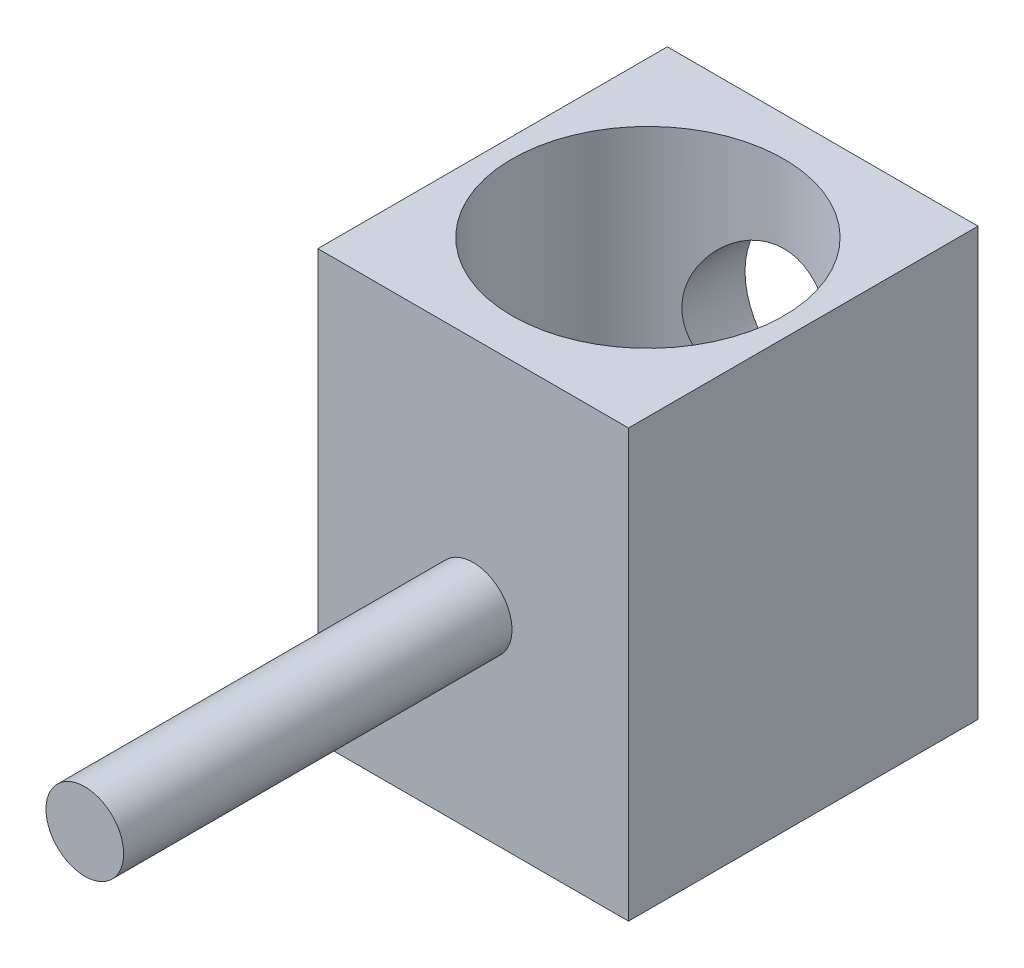
ISO-10303-21;
HEADER;
FILE_DESCRIPTION(('STEP AP214'),'2;1');
FILE_NAME('part.step','',(''),(''),'','','');
FILE_SCHEMA(('AUTOMOTIVE_DESIGN { 1 0 10303 214 1 1 1 1 }'));
ENDSEC;
DATA;
#1=APPLICATION_CONTEXT('core data for automotive mechanical design processes');
#2=APPLICATION_PROTOCOL_DEFINITION('international standard','automotive_design',2000,#1);
#3=PRODUCT_CONTEXT('',#1,'mechanical');
#4=PRODUCT('Part','Part','',(#3));
#5=PRODUCT_RELATED_PRODUCT_CATEGORY('part','',(#4));
#6=PRODUCT_DEFINITION_FORMATION('','',#4);
#7=PRODUCT_DEFINITION_CONTEXT('part definition',#1,'design');
#8=PRODUCT_DEFINITION('design','',#6,#7);
#9=PRODUCT_DEFINITION_SHAPE('','',#8);
#10=(LENGTH_UNIT() NAMED_UNIT(*) SI_UNIT(.MILLI.,.METRE.));
#11=(NAMED_UNIT(*) PLANE_ANGLE_UNIT() SI_UNIT($,.RADIAN.));
#12=(NAMED_UNIT(*) SI_UNIT($,.STERADIAN.) SOLID_ANGLE_UNIT());
#13=UNCERTAINTY_MEASURE_WITH_UNIT(LENGTH_MEASURE(1.E-05),#10,'distance_accuracy_value','');
#14=(GEOMETRIC_REPRESENTATION_CONTEXT(3) GLOBAL_UNCERTAINTY_ASSIGNED_CONTEXT((#13)) GLOBAL_UNIT_ASSIGNED_CONTEXT((#10,
#11,#12)) REPRESENTATION_CONTEXT('',''));
#15=CARTESIAN_POINT('',(0.,0.,0.));
#16=DIRECTION('',(0.,0.,1.));
#17=DIRECTION('',(1.,0.,0.));
#18=AXIS2_PLACEMENT_3D('',#15,#16,#17);
#19=CARTESIAN_POINT('',(2.,5.5,2.25));
#20=DIRECTION('',(-1.,0.,0.));
#21=DIRECTION('',(0.,0.,1.));
#22=AXIS2_PLACEMENT_3D('',#19,#20,#21);
#23=PLANE('',#22);
#24=DIRECTION('',(0.,0.,-1.));
#25=VECTOR('',#24,1.);
#26=CARTESIAN_POINT('',(2.,0.,2.25));
#27=LINE('',#26,#25);
#28=CARTESIAN_POINT('',(2.,0.,2.25));
#29=VERTEX_POINT('',#28);
#30=CARTESIAN_POINT('',(2.,0.,-2.25));
#31=VERTEX_POINT('',#30);
#32=EDGE_CURVE('E103',#29,#31,#27,.T.);
#33=ORIENTED_EDGE('',*,*,#32,.T.);
#34=DIRECTION('',(0.,-1.,0.));
#35=VECTOR('',#34,1.);
#36=CARTESIAN_POINT('',(2.,5.5,-2.25));
#37=LINE('',#36,#35);
#38=CARTESIAN_POINT('',(2.,5.5,-2.25));
#39=VERTEX_POINT('',#38);
#40=EDGE_CURVE('E45',#39,#31,#37,.T.);
#41=ORIENTED_EDGE('',*,*,#40,.F.);
#42=DIRECTION('',(0.,0.,-1.));
#43=VECTOR('',#42,1.);
#44=CARTESIAN_POINT('',(2.,5.5,2.25));
#45=LINE('',#44,#43);
#46=CARTESIAN_POINT('',(2.,5.5,2.25));
#47=VERTEX_POINT('',#46);
#48=EDGE_CURVE('E89',#47,#39,#45,.T.);
#49=ORIENTED_EDGE('',*,*,#48,.F.);
#50=DIRECTION('',(0.,-1.,0.));
#51=VECTOR('',#50,1.);
#52=CARTESIAN_POINT('',(2.,5.5,2.25));
#53=LINE('',#52,#51);
#54=EDGE_CURVE('E99',#47,#29,#53,.T.);
#55=ORIENTED_EDGE('',*,*,#54,.T.);
#56=EDGE_LOOP('',(#33,#41,#49,#55));
#57=FACE_BOUND('',#56,.T.);
#58=ADVANCED_FACE('F32',(#57),#23,.F.);
#59=CARTESIAN_POINT('',(-2.,5.5,-2.25));
#60=DIRECTION('',(0.,0.,1.));
#61=DIRECTION('',(1.,0.,0.));
#62=AXIS2_PLACEMENT_3D('',#59,#60,#61);
#63=PLANE('',#62);
#64=CARTESIAN_POINT('',(0.,3.5,-2.25));
#65=DIRECTION('',(0.,0.,-1.));
#66=DIRECTION('',(-1.,0.,0.));
#67=AXIS2_PLACEMENT_3D('',#64,#65,#66);
#68=CIRCLE('',#67,1.);
#69=CARTESIAN_POINT('',(-1.,3.5,-2.25));
#70=VERTEX_POINT('',#69);
#71=EDGE_CURVE('E213',#70,#70,#68,.T.);
#72=ORIENTED_EDGE('',*,*,#71,.F.);
#73=EDGE_LOOP('',(#72));
#74=FACE_BOUND('',#73,.T.);
#75=DIRECTION('',(-1.,0.,0.));
#76=VECTOR('',#75,1.);
#77=CARTESIAN_POINT('',(-2.,0.,-2.25));
#78=LINE('',#77,#76);
#79=CARTESIAN_POINT('',(-2.,0.,-2.25));
#80=VERTEX_POINT('',#79);
#81=EDGE_CURVE('E94',#31,#80,#78,.T.);
#82=ORIENTED_EDGE('',*,*,#81,.T.);
#83=DIRECTION('',(0.,-1.,0.));
#84=VECTOR('',#83,1.);
#85=CARTESIAN_POINT('',(-2.,5.5,-2.25));
#86=LINE('',#85,#84);
#87=CARTESIAN_POINT('',(-2.,5.5,-2.25));
#88=VERTEX_POINT('',#87);
#89=EDGE_CURVE('E92',#88,#80,#86,.T.);
#90=ORIENTED_EDGE('',*,*,#89,.F.);
#91=DIRECTION('',(-1.,0.,0.));
#92=VECTOR('',#91,1.);
#93=CARTESIAN_POINT('',(-2.,5.5,-2.25));
#94=LINE('',#93,#92);
#95=EDGE_CURVE('E84',#39,#88,#94,.T.);
#96=ORIENTED_EDGE('',*,*,#95,.F.);
#97=ORIENTED_EDGE('',*,*,#40,.T.);
#98=EDGE_LOOP('',(#82,#90,#96,#97));
#99=FACE_BOUND('',#98,.T.);
#100=ADVANCED_FACE('F93',(#74,#99),#63,.F.);
#101=CARTESIAN_POINT('',(-2.,5.5,2.25));
#102=DIRECTION('',(1.,0.,0.));
#103=DIRECTION('',(0.,0.,-1.));
#104=AXIS2_PLACEMENT_3D('',#101,#102,#103);
#105=PLANE('',#104);
#106=DIRECTION('',(0.,0.,1.));
#107=VECTOR('',#106,1.);
#108=CARTESIAN_POINT('',(-2.,0.,2.25));
#109=LINE('',#108,#107);
#110=CARTESIAN_POINT('',(-2.,0.,2.25));
#111=VERTEX_POINT('',#110);
#112=EDGE_CURVE('E70',#80,#111,#109,.T.);
#113=ORIENTED_EDGE('',*,*,#112,.T.);
#114=DIRECTION('',(0.,-1.,0.));
#115=VECTOR('',#114,1.);
#116=CARTESIAN_POINT('',(-2.,5.5,2.25));
#117=LINE('',#116,#115);
#118=CARTESIAN_POINT('',(-2.,5.5,2.25));
#119=VERTEX_POINT('',#118);
#120=EDGE_CURVE('E95',#119,#111,#117,.T.);
#121=ORIENTED_EDGE('',*,*,#120,.F.);
#122=DIRECTION('',(0.,0.,1.));
#123=VECTOR('',#122,1.);
#124=CARTESIAN_POINT('',(-2.,5.5,2.25));
#125=LINE('',#124,#123);
#126=EDGE_CURVE('E87',#88,#119,#125,.T.);
#127=ORIENTED_EDGE('',*,*,#126,.F.);
#128=ORIENTED_EDGE('',*,*,#89,.T.);
#129=EDGE_LOOP('',(#113,#121,#127,#128));
#130=FACE_BOUND('',#129,.T.);
#131=ADVANCED_FACE('F97',(#130),#105,.F.);
#132=CARTESIAN_POINT('',(-2.,5.5,2.25));
#133=DIRECTION('',(0.,0.,-1.));
#134=DIRECTION('',(-1.,0.,0.));
#135=AXIS2_PLACEMENT_3D('',#132,#133,#134);
#136=PLANE('',#135);
#137=CARTESIAN_POINT('',(0.,2.5,2.25));
#138=DIRECTION('',(0.,0.,-1.));
#139=DIRECTION('',(-1.,0.,0.));
#140=AXIS2_PLACEMENT_3D('',#137,#138,#139);
#141=CIRCLE('',#140,0.5);
#142=CARTESIAN_POINT('',(-0.5,2.5,2.25));
#143=VERTEX_POINT('',#142);
#144=EDGE_CURVE('E11',#143,#143,#141,.F.);
#145=ORIENTED_EDGE('',*,*,#144,.F.);
#146=EDGE_LOOP('',(#145));
#147=FACE_BOUND('',#146,.T.);
#148=DIRECTION('',(1.,0.,0.));
#149=VECTOR('',#148,1.);
#150=CARTESIAN_POINT('',(-2.,0.,2.25));
#151=LINE('',#150,#149);
#152=EDGE_CURVE('E76',#111,#29,#151,.T.);
#153=ORIENTED_EDGE('',*,*,#152,.T.);
#154=ORIENTED_EDGE('',*,*,#54,.F.);
#155=DIRECTION('',(1.,0.,0.));
#156=VECTOR('',#155,1.);
#157=CARTESIAN_POINT('',(-2.,5.5,2.25));
#158=LINE('',#157,#156);
#159=EDGE_CURVE('E53',#119,#47,#158,.T.);
#160=ORIENTED_EDGE('',*,*,#159,.F.);
#161=ORIENTED_EDGE('',*,*,#120,.T.);
#162=EDGE_LOOP('',(#153,#154,#160,#161));
#163=FACE_BOUND('',#162,.T.);
#164=ADVANCED_FACE('F126',(#147,#163),#136,.F.);
#165=CARTESIAN_POINT('',(0.,5.5,0.));
#166=DIRECTION('',(0.,-1.,0.));
#167=DIRECTION('',(0.,0.,-1.));
#168=AXIS2_PLACEMENT_3D('',#165,#166,#167);
#169=PLANE('',#168);
#170=CARTESIAN_POINT('',(0.,5.5,0.));
#171=DIRECTION('',(0.,1.,0.));
#172=DIRECTION('',(0.,0.,1.));
#173=AXIS2_PLACEMENT_3D('',#170,#171,#172);
#174=CIRCLE('',#173,1.75);
#175=CARTESIAN_POINT('',(0.,5.5,1.75));
#176=VERTEX_POINT('',#175);
#177=EDGE_CURVE('E208',#176,#176,#174,.T.);
#178=ORIENTED_EDGE('',*,*,#177,.F.);
#179=EDGE_LOOP('',(#178));
#180=FACE_BOUND('',#179,.T.);
#181=ORIENTED_EDGE('',*,*,#48,.T.);
#182=ORIENTED_EDGE('',*,*,#95,.T.);
#183=ORIENTED_EDGE('',*,*,#126,.T.);
#184=ORIENTED_EDGE('',*,*,#159,.T.);
#185=EDGE_LOOP('',(#181,#182,#183,#184));
#186=FACE_BOUND('',#185,.T.);
#187=ADVANCED_FACE('F85',(#180,#186),#169,.F.);
#188=CARTESIAN_POINT('',(0.,0.,0.));
#189=DIRECTION('',(0.,-1.,0.));
#190=DIRECTION('',(0.,0.,-1.));
#191=AXIS2_PLACEMENT_3D('',#188,#189,#190);
#192=PLANE('',#191);
#193=ORIENTED_EDGE('',*,*,#32,.F.);
#194=ORIENTED_EDGE('',*,*,#152,.F.);
#195=ORIENTED_EDGE('',*,*,#112,.F.);
#196=ORIENTED_EDGE('',*,*,#81,.F.);
#197=EDGE_LOOP('',(#193,#194,#195,#196));
#198=FACE_BOUND('',#197,.T.);
#199=ADVANCED_FACE('F115',(#198),#192,.T.);
#200=CARTESIAN_POINT('',(0.,2.5,7.25));
#201=DIRECTION('',(0.,0.,-1.));
#202=DIRECTION('',(-1.,0.,0.));
#203=AXIS2_PLACEMENT_3D('',#200,#201,#202);
#204=CYLINDRICAL_SURFACE('',#203,0.5);
#205=CARTESIAN_POINT('',(0.,2.5,7.25));
#206=DIRECTION('',(0.,0.,1.));
#207=DIRECTION('',(1.,0.,0.));
#208=AXIS2_PLACEMENT_3D('',#205,#206,#207);
#209=CIRCLE('',#208,0.5);
#210=CARTESIAN_POINT('',(0.5,2.5,7.25));
#211=VERTEX_POINT('',#210);
#212=EDGE_CURVE('E106',#211,#211,#209,.T.);
#213=ORIENTED_EDGE('',*,*,#212,.F.);
#214=EDGE_LOOP('',(#213));
#215=FACE_BOUND('',#214,.T.);
#216=ORIENTED_EDGE('',*,*,#144,.T.);
#217=EDGE_LOOP('',(#216));
#218=FACE_BOUND('',#217,.T.);
#219=ADVANCED_FACE('F117',(#215,#218),#204,.T.);
#220=CARTESIAN_POINT('',(0.,2.5,7.25));
#221=DIRECTION('',(0.,0.,1.));
#222=DIRECTION('',(1.,0.,0.));
#223=AXIS2_PLACEMENT_3D('',#220,#221,#222);
#224=PLANE('',#223);
#225=ORIENTED_EDGE('',*,*,#212,.T.);
#226=EDGE_LOOP('',(#225));
#227=FACE_BOUND('',#226,.T.);
#228=ADVANCED_FACE('F123',(#227),#224,.T.);
#229=CARTESIAN_POINT('',(0.,0.5,0.));
#230=DIRECTION('',(0.,1.,0.));
#231=DIRECTION('',(0.,0.,1.));
#232=AXIS2_PLACEMENT_3D('',#229,#230,#231);
#233=CYLINDRICAL_SURFACE('',#232,1.75);
#234=CARTESIAN_POINT('',(-1.,3.5,-1.43614066163451));
#235=CARTESIAN_POINT('',(-0.999998977889854,3.55087964150982,-1.43614227357067));
#236=CARTESIAN_POINT('',(-0.996092596359012,3.60176663583403,-1.43888533815491));
#237=CARTESIAN_POINT('',(-0.980724655385719,3.70186729768916,-1.44940023340477));
#238=CARTESIAN_POINT('',(-0.969255040319518,3.75107912215393,-1.45717742577314));
#239=CARTESIAN_POINT('',(-0.939480288296559,3.84618925033014,-1.47654538132944));
#240=CARTESIAN_POINT('',(-0.921219515698671,3.89210680141847,-1.48811133660115));
#241=CARTESIAN_POINT('',(-0.878521268500316,3.98020799948762,-1.51371029638409));
#242=CARTESIAN_POINT('',(-0.854081813982537,4.02239044371693,-1.52774409125834));
#243=CARTESIAN_POINT('',(-0.7965876066546,4.1069096706477,-1.55856464395334));
#244=CARTESIAN_POINT('',(-0.762881603545924,4.14875503266233,-1.57548449182979));
#245=CARTESIAN_POINT('',(-0.68915194070003,4.22659895393185,-1.60910317245543));
#246=CARTESIAN_POINT('',(-0.649124201025539,4.26259370665327,-1.62580185487246));
#247=CARTESIAN_POINT('',(-0.559270801354421,4.33108354246754,-1.65898119820319));
#248=CARTESIAN_POINT('',(-0.508875889162424,4.36292271412071,-1.67529090375186));
#249=CARTESIAN_POINT('',(-0.402335980295194,4.4174404349974,-1.70401271449815));
#250=CARTESIAN_POINT('',(-0.346195785157105,4.44012655662634,-1.71642803965327));
#251=CARTESIAN_POINT('',(-0.235008139679148,4.47356905019697,-1.73498168186071));
#252=CARTESIAN_POINT('',(-0.180302902987176,4.48520282081855,-1.74157791296527));
#253=CARTESIAN_POINT('',(-0.0693568560582203,4.49915350197524,-1.74950644863425));
#254=CARTESIAN_POINT('',(-0.0131173588471083,4.50147814213955,-1.75084312034064));
#255=CARTESIAN_POINT('',(0.0924734818939762,4.49695655007991,-1.74826255120499));
#256=CARTESIAN_POINT('',(0.141886288584284,4.49111512178047,-1.74492089133201));
#257=CARTESIAN_POINT('',(0.238889641360083,4.47230273777696,-1.73430455283025));
#258=CARTESIAN_POINT('',(0.286480053110829,4.45933125757122,-1.72702958485967));
#259=CARTESIAN_POINT('',(0.379089248381771,4.42667450385034,-1.70910454068425));
#260=CARTESIAN_POINT('',(0.424081438692432,4.40693062628898,-1.69842506296613));
#261=CARTESIAN_POINT('',(0.510189138760997,4.36144107942,-1.67457634379613));
#262=CARTESIAN_POINT('',(0.551303500394734,4.3356936403997,-1.66140636841924));
#263=CARTESIAN_POINT('',(0.633464592515743,4.2756270393387,-1.63197277650127));
#264=CARTESIAN_POINT('',(0.673978280289227,4.24066792080302,-1.61552774080149));
#265=CARTESIAN_POINT('',(0.748894903554734,4.16483267024454,-1.58219518621625));
#266=CARTESIAN_POINT('',(0.783290323257738,4.12394937115033,-1.56530715195406));
#267=CARTESIAN_POINT('',(0.848431099483351,4.03255988858479,-1.53106121559793));
#268=CARTESIAN_POINT('',(0.878471307285936,3.98150077922501,-1.51382415536533));
#269=CARTESIAN_POINT('',(0.929340847529251,3.8739612370364,-1.48314350978915));
#270=CARTESIAN_POINT('',(0.950186500361941,3.81749062837976,-1.4696932183879));
#271=CARTESIAN_POINT('',(0.977937000725396,3.71404520468792,-1.45132681474691));
#272=CARTESIAN_POINT('',(0.986940346447266,3.66785432891361,-1.44516214338295));
#273=CARTESIAN_POINT('',(0.998345130733772,3.57430591457719,-1.43730929067551));
#274=CARTESIAN_POINT('',(1.00075289898374,3.52694953860984,-1.43561681747996));
#275=CARTESIAN_POINT('',(0.998834315446935,3.43241828393952,-1.43695188859507));
#276=CARTESIAN_POINT('',(0.994503981779946,3.38524352908349,-1.4399822238503));
#277=CARTESIAN_POINT('',(0.979350764037259,3.29242520177111,-1.45032873490101));
#278=CARTESIAN_POINT('',(0.96852314988933,3.2467827704457,-1.45764803300458));
#279=CARTESIAN_POINT('',(0.940704234214778,3.15752335916664,-1.47575455899495));
#280=CARTESIAN_POINT('',(0.923637441392281,3.11393890263757,-1.48658406874148));
#281=CARTESIAN_POINT('',(0.883928514933453,3.03007902058575,-1.51053209765112));
#282=CARTESIAN_POINT('',(0.86128410693305,2.98980495388594,-1.52365154993841));
#283=CARTESIAN_POINT('',(0.806707004474784,2.90662634076682,-1.55333199880963));
#284=CARTESIAN_POINT('',(0.773855998020502,2.86439764256501,-1.57010254037334));
#285=CARTESIAN_POINT('',(0.701829575586844,2.78565713937083,-1.60359437241346));
#286=CARTESIAN_POINT('',(0.662648927218295,2.74915011380793,-1.6203156103874));
#287=CARTESIAN_POINT('',(0.574337473483236,2.67926063047169,-1.65380781155772));
#288=CARTESIAN_POINT('',(0.524603729631419,2.64655436829112,-1.67041695553672));
#289=CARTESIAN_POINT('',(0.419251024451553,2.59017077638328,-1.69991510770318));
#290=CARTESIAN_POINT('',(0.36363675887979,2.56648631103712,-1.71280705396769));
#291=CARTESIAN_POINT('',(0.252848784112839,2.53089178764827,-1.73247499557566));
#292=CARTESIAN_POINT('',(0.198008073088558,2.51817989291006,-1.73966357636034));
#293=CARTESIAN_POINT('',(0.0865552662624648,2.50216768340128,-1.74874920358857));
#294=CARTESIAN_POINT('',(0.0299447812378392,2.49885904858976,-1.75065092783082));
#295=CARTESIAN_POINT('',(-0.0763317231940706,2.50166850348203,-1.74904753682976));
#296=CARTESIAN_POINT('',(-0.126039090532012,2.5067341861847,-1.74614599114738));
#297=CARTESIAN_POINT('',(-0.223758212186591,2.52409292982414,-1.73633040462683));
#298=CARTESIAN_POINT('',(-0.271769877470404,2.53638636965799,-1.72941615343286));
#299=CARTESIAN_POINT('',(-0.364970313459144,2.56768062954384,-1.71217678378424));
#300=CARTESIAN_POINT('',(-0.410154305845431,2.58669246056275,-1.70184606777984));
#301=CARTESIAN_POINT('',(-0.496748817456396,2.63074569584162,-1.67861643411134));
#302=CARTESIAN_POINT('',(-0.53815829967177,2.6557887502788,-1.66571681374781));
#303=CARTESIAN_POINT('',(-0.62091085583814,2.71430736188585,-1.63679426081819));
#304=CARTESIAN_POINT('',(-0.661746610886868,2.74840714139315,-1.62058388186673));
#305=CARTESIAN_POINT('',(-0.737445111520594,2.82251534756113,-1.58757174680514));
#306=CARTESIAN_POINT('',(-0.772300624674698,2.86253082126869,-1.57076930383792));
#307=CARTESIAN_POINT('',(-0.838730224493786,2.95230650800843,-1.5364148007342));
#308=CARTESIAN_POINT('',(-0.869579580605462,3.00264822242125,-1.51896820380244));
#309=CARTESIAN_POINT('',(-0.922223246340506,3.10884591400318,-1.48759837748897));
#310=CARTESIAN_POINT('',(-0.944032383853114,3.1646926739501,-1.47366939325578));
#311=CARTESIAN_POINT('',(-0.973615681017506,3.2671371195097,-1.45423881619702));
#312=CARTESIAN_POINT('',(-0.983464091724214,3.3129081701631,-1.44753581227649));
#313=CARTESIAN_POINT('',(-0.996653687832909,3.40578490416839,-1.43848802243486));
#314=CARTESIAN_POINT('',(-1.00000094639669,3.4528893001682,-1.43613916910354));
#315=CARTESIAN_POINT('',(-1.,3.5,-1.43614066163451));
#316=B_SPLINE_CURVE_WITH_KNOTS('',3,(#234,#235,#236,#237,#238,#239,#240,#241,#242,#243,#244,
#245,#246,#247,#248,#249,#250,#251,#252,#253,#254,#255,#256,#257,#258,#259,#260,#261,#262,#263,
#264,#265,#266,#267,#268,#269,#270,#271,#272,#273,#274,#275,#276,#277,#278,#279,#280,#281,#282,
#283,#284,#285,#286,#287,#288,#289,#290,#291,#292,#293,#294,#295,#296,#297,#298,#299,#300,#301,
#302,#303,#304,#305,#306,#307,#308,#309,#310,#311,#312,#313,#314,#315),.UNSPECIFIED.,.T.,.F.,(4,
2,2,2,2,2,2,2,2,2,2,2,2,2,2,2,2,2,2,2,2,2,2,2,2,2,2,2,2,2,2,2,2,2,2,2,2,2,2,2,4),(0.,
0.152441937461022,0.305046504135111,0.456671184008118,0.608344512716836,0.776668472465008,
0.94510151282121,1.12951271296531,1.31377103357994,1.48173880427779,1.6495670777229,
1.79846611019896,1.94737609746844,2.09760859881263,2.2478854413748,2.41515016671163,
2.58261896499772,2.76677394366069,2.95060071758437,3.09236374109813,3.23399066883803,
3.3757013227785,3.51751526858611,3.6611051861799,3.8047537521304,3.97228426627418,
4.13995398466083,4.32436925315494,4.50863835752582,4.67790022395545,4.84701228013167,
4.99644038007996,5.14587631412116,5.29555830770719,5.44528130176249,5.61145683580219,
5.77783194515264,5.96161199306391,6.14508939813778,6.28637114685419,6.42752085122302),.UNSPECIFIED.);
#317=CARTESIAN_POINT('',(-1.,3.5,-1.43614066163451));
#318=VERTEX_POINT('',#317);
#319=EDGE_CURVE('E35',#318,#318,#316,.T.);
#320=ORIENTED_EDGE('',*,*,#319,.T.);
#321=EDGE_LOOP('',(#320));
#322=FACE_BOUND('',#321,.T.);
#323=CARTESIAN_POINT('',(0.,0.5,0.));
#324=DIRECTION('',(0.,1.,0.));
#325=DIRECTION('',(0.,0.,1.));
#326=AXIS2_PLACEMENT_3D('',#323,#324,#325);
#327=CIRCLE('',#326,1.75);
#328=CARTESIAN_POINT('',(0.,0.5,1.75));
#329=VERTEX_POINT('',#328);
#330=EDGE_CURVE('E205',#329,#329,#327,.T.);
#331=ORIENTED_EDGE('',*,*,#330,.F.);
#332=EDGE_LOOP('',(#331));
#333=FACE_BOUND('',#332,.T.);
#334=ORIENTED_EDGE('',*,*,#177,.T.);
#335=EDGE_LOOP('',(#334));
#336=FACE_BOUND('',#335,.T.);
#337=ADVANCED_FACE('F168',(#322,#333,#336),#233,.F.);
#338=CARTESIAN_POINT('',(0.,0.5,0.));
#339=DIRECTION('',(0.,1.,0.));
#340=DIRECTION('',(0.,0.,1.));
#341=AXIS2_PLACEMENT_3D('',#338,#339,#340);
#342=PLANE('',#341);
#343=ORIENTED_EDGE('',*,*,#330,.T.);
#344=EDGE_LOOP('',(#343));
#345=FACE_BOUND('',#344,.T.);
#346=ADVANCED_FACE('F163',(#345),#342,.T.);
#347=CARTESIAN_POINT('',(0.,3.5,-0.25));
#348=DIRECTION('',(0.,0.,-1.));
#349=DIRECTION('',(-1.,0.,0.));
#350=AXIS2_PLACEMENT_3D('',#347,#348,#349);
#351=CYLINDRICAL_SURFACE('',#350,1.);
#352=ORIENTED_EDGE('',*,*,#71,.T.);
#353=EDGE_LOOP('',(#352));
#354=FACE_BOUND('',#353,.T.);
#355=ORIENTED_EDGE('',*,*,#319,.F.);
#356=EDGE_LOOP('',(#355));
#357=FACE_BOUND('',#356,.T.);
#358=ADVANCED_FACE('F167',(#354,#357),#351,.F.);
#359=CLOSED_SHELL('',(#58,#100,#131,#164,#187,#199,#219,#228,#337,#346,#358));
#360=MANIFOLD_SOLID_BREP('B2',#359);
#361=ADVANCED_BREP_SHAPE_REPRESENTATION('',(#18,#360),#14);
#362=SHAPE_DEFINITION_REPRESENTATION(#9,#361);
ENDSEC;
END-ISO-10303-21;
